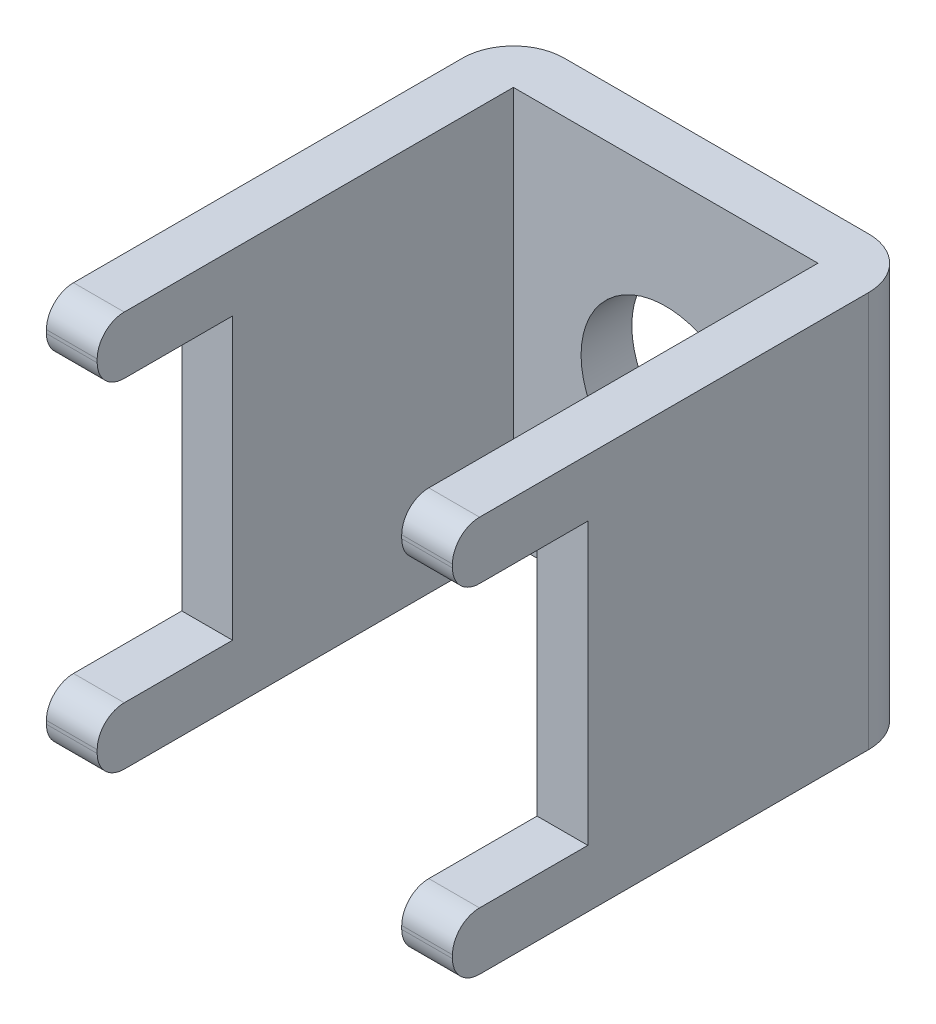
ISO-10303-21;
HEADER;
FILE_DESCRIPTION(('STEP AP214'),'2;1');
FILE_NAME('part.step','',(''),(''),'','','');
FILE_SCHEMA(('AUTOMOTIVE_DESIGN { 1 0 10303 214 1 1 1 1 }'));
ENDSEC;
DATA;
#1=APPLICATION_CONTEXT('core data for automotive mechanical design processes');
#2=APPLICATION_PROTOCOL_DEFINITION('international standard','automotive_design',2000,#1);
#3=PRODUCT_CONTEXT('',#1,'mechanical');
#4=PRODUCT('Part','Part','',(#3));
#5=PRODUCT_RELATED_PRODUCT_CATEGORY('part','',(#4));
#6=PRODUCT_DEFINITION_FORMATION('','',#4);
#7=PRODUCT_DEFINITION_CONTEXT('part definition',#1,'design');
#8=PRODUCT_DEFINITION('design','',#6,#7);
#9=PRODUCT_DEFINITION_SHAPE('','',#8);
#10=(LENGTH_UNIT() NAMED_UNIT(*) SI_UNIT(.MILLI.,.METRE.));
#11=(NAMED_UNIT(*) PLANE_ANGLE_UNIT() SI_UNIT($,.RADIAN.));
#12=(NAMED_UNIT(*) SI_UNIT($,.STERADIAN.) SOLID_ANGLE_UNIT());
#13=UNCERTAINTY_MEASURE_WITH_UNIT(LENGTH_MEASURE(1.E-05),#10,'distance_accuracy_value','');
#14=(GEOMETRIC_REPRESENTATION_CONTEXT(3) GLOBAL_UNCERTAINTY_ASSIGNED_CONTEXT((#13)) GLOBAL_UNIT_ASSIGNED_CONTEXT((#10,
#11,#12)) REPRESENTATION_CONTEXT('',''));
#15=CARTESIAN_POINT('',(0.,0.,0.));
#16=DIRECTION('',(0.,0.,1.));
#17=DIRECTION('',(1.,0.,0.));
#18=AXIS2_PLACEMENT_3D('',#15,#16,#17);
#19=CARTESIAN_POINT('',(10.5,11.7,0.));
#20=DIRECTION('',(0.,0.,-1.));
#21=DIRECTION('',(-1.,0.,0.));
#22=AXIS2_PLACEMENT_3D('',#19,#20,#21);
#23=PLANE('',#22);
#24=DIRECTION('',(0.,-1.,0.));
#25=VECTOR('',#24,1.);
#26=CARTESIAN_POINT('',(9.,11.7,0.));
#27=LINE('',#26,#25);
#28=CARTESIAN_POINT('',(9.,10.9,0.));
#29=VERTEX_POINT('',#28);
#30=CARTESIAN_POINT('',(9.,10.8,0.));
#31=VERTEX_POINT('',#30);
#32=EDGE_CURVE('E329',#29,#31,#27,.T.);
#33=ORIENTED_EDGE('',*,*,#32,.T.);
#34=DIRECTION('',(1.,0.,0.));
#35=VECTOR('',#34,1.);
#36=CARTESIAN_POINT('',(10.5,10.8,0.));
#37=LINE('',#36,#35);
#38=CARTESIAN_POINT('',(10.5,10.8,0.));
#39=VERTEX_POINT('',#38);
#40=EDGE_CURVE('E338',#31,#39,#37,.T.);
#41=ORIENTED_EDGE('',*,*,#40,.T.);
#42=DIRECTION('',(0.,-1.,0.));
#43=VECTOR('',#42,1.);
#44=CARTESIAN_POINT('',(10.5,11.7,0.));
#45=LINE('',#44,#43);
#46=CARTESIAN_POINT('',(10.5,10.9,0.));
#47=VERTEX_POINT('',#46);
#48=EDGE_CURVE('E325',#47,#39,#45,.T.);
#49=ORIENTED_EDGE('',*,*,#48,.F.);
#50=DIRECTION('',(1.,0.,0.));
#51=VECTOR('',#50,1.);
#52=CARTESIAN_POINT('',(10.5,10.9,0.));
#53=LINE('',#52,#51);
#54=EDGE_CURVE('E336',#47,#29,#53,.F.);
#55=ORIENTED_EDGE('',*,*,#54,.T.);
#56=EDGE_LOOP('',(#33,#41,#49,#55));
#57=FACE_BOUND('',#56,.T.);
#58=ADVANCED_FACE('F39',(#57),#23,.F.);
#59=CARTESIAN_POINT('',(0.,11.7,0.));
#60=DIRECTION('',(0.,0.,-1.));
#61=DIRECTION('',(-1.,0.,0.));
#62=AXIS2_PLACEMENT_3D('',#59,#60,#61);
#63=PLANE('',#62);
#64=DIRECTION('',(0.,-1.,0.));
#65=VECTOR('',#64,1.);
#66=CARTESIAN_POINT('',(-1.5,11.7,0.));
#67=LINE('',#66,#65);
#68=CARTESIAN_POINT('',(-1.5,10.9,0.));
#69=VERTEX_POINT('',#68);
#70=CARTESIAN_POINT('',(-1.5,10.8,0.));
#71=VERTEX_POINT('',#70);
#72=EDGE_CURVE('E309',#69,#71,#67,.T.);
#73=ORIENTED_EDGE('',*,*,#72,.T.);
#74=DIRECTION('',(1.,0.,0.));
#75=VECTOR('',#74,1.);
#76=CARTESIAN_POINT('',(0.,10.8,0.));
#77=LINE('',#76,#75);
#78=CARTESIAN_POINT('',(0.,10.8,0.));
#79=VERTEX_POINT('',#78);
#80=EDGE_CURVE('E377',#71,#79,#77,.T.);
#81=ORIENTED_EDGE('',*,*,#80,.T.);
#82=DIRECTION('',(0.,-1.,0.));
#83=VECTOR('',#82,1.);
#84=CARTESIAN_POINT('',(0.,11.7,0.));
#85=LINE('',#84,#83);
#86=CARTESIAN_POINT('',(0.,10.9,0.));
#87=VERTEX_POINT('',#86);
#88=EDGE_CURVE('E306',#87,#79,#85,.T.);
#89=ORIENTED_EDGE('',*,*,#88,.F.);
#90=DIRECTION('',(1.,0.,0.));
#91=VECTOR('',#90,1.);
#92=CARTESIAN_POINT('',(0.,10.9,0.));
#93=LINE('',#92,#91);
#94=EDGE_CURVE('E375',#87,#69,#93,.F.);
#95=ORIENTED_EDGE('',*,*,#94,.T.);
#96=EDGE_LOOP('',(#73,#81,#89,#95));
#97=FACE_BOUND('',#96,.T.);
#98=ADVANCED_FACE('F461',(#97),#63,.F.);
#99=CARTESIAN_POINT('',(0.,11.7,-12.3));
#100=DIRECTION('',(-1.,0.,0.));
#101=DIRECTION('',(0.,0.,1.));
#102=AXIS2_PLACEMENT_3D('',#99,#100,#101);
#103=PLANE('',#102);
#104=ORIENTED_EDGE('',*,*,#88,.T.);
#105=CARTESIAN_POINT('',(0.,10.8,-0.8));
#106=DIRECTION('',(-1.,0.,0.));
#107=DIRECTION('',(0.,0.,1.));
#108=AXIS2_PLACEMENT_3D('',#105,#106,#107);
#109=CIRCLE('',#108,0.8);
#110=CARTESIAN_POINT('',(0.,10.,-0.8));
#111=VERTEX_POINT('',#110);
#112=EDGE_CURVE('E386',#79,#111,#109,.F.);
#113=ORIENTED_EDGE('',*,*,#112,.T.);
#114=DIRECTION('',(0.,0.,-1.));
#115=VECTOR('',#114,1.);
#116=CARTESIAN_POINT('',(0.,10.,-12.3));
#117=LINE('',#116,#115);
#118=CARTESIAN_POINT('',(0.,10.,-4.));
#119=VERTEX_POINT('',#118);
#120=EDGE_CURVE('E262',#111,#119,#117,.T.);
#121=ORIENTED_EDGE('',*,*,#120,.T.);
#122=DIRECTION('',(0.,-1.,0.));
#123=VECTOR('',#122,1.);
#124=CARTESIAN_POINT('',(0.,11.7,-4.));
#125=LINE('',#124,#123);
#126=CARTESIAN_POINT('',(0.,1.7,-4.));
#127=VERTEX_POINT('',#126);
#128=EDGE_CURVE('E265',#119,#127,#125,.T.);
#129=ORIENTED_EDGE('',*,*,#128,.T.);
#130=DIRECTION('',(0.,0.,1.));
#131=VECTOR('',#130,1.);
#132=CARTESIAN_POINT('',(0.,1.7,-12.3));
#133=LINE('',#132,#131);
#134=CARTESIAN_POINT('',(0.,1.7,-0.8));
#135=VERTEX_POINT('',#134);
#136=EDGE_CURVE('E256',#127,#135,#133,.T.);
#137=ORIENTED_EDGE('',*,*,#136,.T.);
#138=CARTESIAN_POINT('',(0.,0.9,-0.8));
#139=DIRECTION('',(-1.,0.,0.));
#140=DIRECTION('',(0.,0.,1.));
#141=AXIS2_PLACEMENT_3D('',#138,#139,#140);
#142=CIRCLE('',#141,0.8);
#143=CARTESIAN_POINT('',(0.,0.9,0.));
#144=VERTEX_POINT('',#143);
#145=EDGE_CURVE('E380',#135,#144,#142,.F.);
#146=ORIENTED_EDGE('',*,*,#145,.T.);
#147=CARTESIAN_POINT('',(0.,0.8,0.));
#148=VERTEX_POINT('',#147);
#149=EDGE_CURVE('E288',#144,#148,#85,.T.);
#150=ORIENTED_EDGE('',*,*,#149,.T.);
#151=CARTESIAN_POINT('',(0.,0.8,-0.8));
#152=DIRECTION('',(-1.,0.,0.));
#153=DIRECTION('',(0.,0.,1.));
#154=AXIS2_PLACEMENT_3D('',#151,#152,#153);
#155=CIRCLE('',#154,0.8);
#156=CARTESIAN_POINT('',(0.,0.,-0.800000000000004));
#157=VERTEX_POINT('',#156);
#158=EDGE_CURVE('E382',#148,#157,#155,.F.);
#159=ORIENTED_EDGE('',*,*,#158,.T.);
#160=DIRECTION('',(0.,0.,-1.));
#161=VECTOR('',#160,1.);
#162=CARTESIAN_POINT('',(0.,0.,-12.3));
#163=LINE('',#162,#161);
#164=CARTESIAN_POINT('',(0.,0.,-12.3));
#165=VERTEX_POINT('',#164);
#166=EDGE_CURVE('E268',#157,#165,#163,.T.);
#167=ORIENTED_EDGE('',*,*,#166,.T.);
#168=DIRECTION('',(0.,-1.,0.));
#169=VECTOR('',#168,1.);
#170=CARTESIAN_POINT('',(0.,11.7,-12.3));
#171=LINE('',#170,#169);
#172=CARTESIAN_POINT('',(0.,11.7,-12.3));
#173=VERTEX_POINT('',#172);
#174=EDGE_CURVE('E333',#173,#165,#171,.T.);
#175=ORIENTED_EDGE('',*,*,#174,.F.);
#176=DIRECTION('',(0.,0.,-1.));
#177=VECTOR('',#176,1.);
#178=CARTESIAN_POINT('',(0.,11.7,-12.3));
#179=LINE('',#178,#177);
#180=CARTESIAN_POINT('',(0.,11.7,-0.800000000000004));
#181=VERTEX_POINT('',#180);
#182=EDGE_CURVE('E269',#181,#173,#179,.T.);
#183=ORIENTED_EDGE('',*,*,#182,.F.);
#184=CARTESIAN_POINT('',(0.,10.9,-0.8));
#185=DIRECTION('',(-1.,0.,0.));
#186=DIRECTION('',(0.,0.,1.));
#187=AXIS2_PLACEMENT_3D('',#184,#185,#186);
#188=CIRCLE('',#187,0.8);
#189=EDGE_CURVE('E384',#181,#87,#188,.F.);
#190=ORIENTED_EDGE('',*,*,#189,.T.);
#191=EDGE_LOOP('',(#104,#113,#121,#129,#137,#146,#150,#159,#167,#175,#183,#190));
#192=FACE_BOUND('',#191,.T.);
#193=ADVANCED_FACE('F406',(#192),#103,.F.);
#194=CARTESIAN_POINT('',(9.,11.7,-12.3));
#195=DIRECTION('',(0.,0.,-1.));
#196=DIRECTION('',(-1.,0.,0.));
#197=AXIS2_PLACEMENT_3D('',#194,#195,#196);
#198=PLANE('',#197);
#199=CARTESIAN_POINT('',(4.5,5.85,-12.3));
#200=DIRECTION('',(0.,0.,-1.));
#201=DIRECTION('',(-1.,0.,0.));
#202=AXIS2_PLACEMENT_3D('',#199,#200,#201);
#203=CIRCLE('',#202,2.5);
#204=CARTESIAN_POINT('',(2.,5.85,-12.3));
#205=VERTEX_POINT('',#204);
#206=EDGE_CURVE('E225',#205,#205,#203,.F.);
#207=ORIENTED_EDGE('',*,*,#206,.F.);
#208=EDGE_LOOP('',(#207));
#209=FACE_BOUND('',#208,.T.);
#210=DIRECTION('',(1.,0.,0.));
#211=VECTOR('',#210,1.);
#212=CARTESIAN_POINT('',(9.,0.,-12.3));
#213=LINE('',#212,#211);
#214=CARTESIAN_POINT('',(9.,0.,-12.3));
#215=VERTEX_POINT('',#214);
#216=EDGE_CURVE('E290',#165,#215,#213,.T.);
#217=ORIENTED_EDGE('',*,*,#216,.T.);
#218=DIRECTION('',(0.,-1.,0.));
#219=VECTOR('',#218,1.);
#220=CARTESIAN_POINT('',(9.,11.7,-12.3));
#221=LINE('',#220,#219);
#222=CARTESIAN_POINT('',(9.,11.7,-12.3));
#223=VERTEX_POINT('',#222);
#224=EDGE_CURVE('E330',#223,#215,#221,.T.);
#225=ORIENTED_EDGE('',*,*,#224,.F.);
#226=DIRECTION('',(1.,0.,0.));
#227=VECTOR('',#226,1.);
#228=CARTESIAN_POINT('',(9.,11.7,-12.3));
#229=LINE('',#228,#227);
#230=EDGE_CURVE('E271',#173,#223,#229,.T.);
#231=ORIENTED_EDGE('',*,*,#230,.F.);
#232=ORIENTED_EDGE('',*,*,#174,.T.);
#233=EDGE_LOOP('',(#217,#225,#231,#232));
#234=FACE_BOUND('',#233,.T.);
#235=ADVANCED_FACE('F481',(#209,#234),#198,.F.);
#236=CARTESIAN_POINT('',(9.,11.7,0.));
#237=DIRECTION('',(1.,0.,0.));
#238=DIRECTION('',(0.,0.,-1.));
#239=AXIS2_PLACEMENT_3D('',#236,#237,#238);
#240=PLANE('',#239);
#241=DIRECTION('',(0.,0.,1.));
#242=VECTOR('',#241,1.);
#243=CARTESIAN_POINT('',(9.,10.,0.));
#244=LINE('',#243,#242);
#245=CARTESIAN_POINT('',(9.00000000000001,10.,-4.));
#246=VERTEX_POINT('',#245);
#247=CARTESIAN_POINT('',(9.,10.,-0.8));
#248=VERTEX_POINT('',#247);
#249=EDGE_CURVE('E259',#246,#248,#244,.T.);
#250=ORIENTED_EDGE('',*,*,#249,.T.);
#251=CARTESIAN_POINT('',(9.,10.8,-0.8));
#252=DIRECTION('',(1.,0.,0.));
#253=DIRECTION('',(0.,0.,-1.));
#254=AXIS2_PLACEMENT_3D('',#251,#252,#253);
#255=CIRCLE('',#254,0.8);
#256=EDGE_CURVE('E357',#248,#31,#255,.F.);
#257=ORIENTED_EDGE('',*,*,#256,.T.);
#258=ORIENTED_EDGE('',*,*,#32,.F.);
#259=CARTESIAN_POINT('',(9.,10.9,-0.8));
#260=DIRECTION('',(1.,0.,0.));
#261=DIRECTION('',(0.,0.,-1.));
#262=AXIS2_PLACEMENT_3D('',#259,#260,#261);
#263=CIRCLE('',#262,0.8);
#264=CARTESIAN_POINT('',(9.,11.7,-0.8));
#265=VERTEX_POINT('',#264);
#266=EDGE_CURVE('E355',#29,#265,#263,.F.);
#267=ORIENTED_EDGE('',*,*,#266,.T.);
#268=DIRECTION('',(0.,0.,1.));
#269=VECTOR('',#268,1.);
#270=CARTESIAN_POINT('',(9.,11.7,0.));
#271=LINE('',#270,#269);
#272=EDGE_CURVE('E274',#223,#265,#271,.T.);
#273=ORIENTED_EDGE('',*,*,#272,.F.);
#274=ORIENTED_EDGE('',*,*,#224,.T.);
#275=DIRECTION('',(0.,0.,1.));
#276=VECTOR('',#275,1.);
#277=CARTESIAN_POINT('',(9.,0.,0.));
#278=LINE('',#277,#276);
#279=CARTESIAN_POINT('',(9.,0.,-0.8));
#280=VERTEX_POINT('',#279);
#281=EDGE_CURVE('E292',#215,#280,#278,.T.);
#282=ORIENTED_EDGE('',*,*,#281,.T.);
#283=CARTESIAN_POINT('',(9.,0.8,-0.8));
#284=DIRECTION('',(1.,0.,0.));
#285=DIRECTION('',(0.,0.,-1.));
#286=AXIS2_PLACEMENT_3D('',#283,#284,#285);
#287=CIRCLE('',#286,0.8);
#288=CARTESIAN_POINT('',(9.,0.8,0.));
#289=VERTEX_POINT('',#288);
#290=EDGE_CURVE('E353',#280,#289,#287,.F.);
#291=ORIENTED_EDGE('',*,*,#290,.T.);
#292=CARTESIAN_POINT('',(9.,0.9,0.));
#293=VERTEX_POINT('',#292);
#294=EDGE_CURVE('E326',#293,#289,#27,.T.);
#295=ORIENTED_EDGE('',*,*,#294,.F.);
#296=CARTESIAN_POINT('',(9.00000000000001,0.9,-0.8));
#297=DIRECTION('',(1.,0.,0.));
#298=DIRECTION('',(0.,0.,-1.));
#299=AXIS2_PLACEMENT_3D('',#296,#297,#298);
#300=CIRCLE('',#299,0.8);
#301=CARTESIAN_POINT('',(9.,1.7,-0.8));
#302=VERTEX_POINT('',#301);
#303=EDGE_CURVE('E351',#293,#302,#300,.F.);
#304=ORIENTED_EDGE('',*,*,#303,.T.);
#305=DIRECTION('',(0.,0.,-1.));
#306=VECTOR('',#305,1.);
#307=CARTESIAN_POINT('',(9.,1.7,0.));
#308=LINE('',#307,#306);
#309=CARTESIAN_POINT('',(9.00000000000001,1.7,-4.));
#310=VERTEX_POINT('',#309);
#311=EDGE_CURVE('E253',#302,#310,#308,.T.);
#312=ORIENTED_EDGE('',*,*,#311,.T.);
#313=DIRECTION('',(0.,1.,0.));
#314=VECTOR('',#313,1.);
#315=CARTESIAN_POINT('',(9.,11.7,-4.));
#316=LINE('',#315,#314);
#317=EDGE_CURVE('E234',#310,#246,#316,.T.);
#318=ORIENTED_EDGE('',*,*,#317,.T.);
#319=EDGE_LOOP('',(#250,#257,#258,#267,#273,#274,#282,#291,#295,#304,#312,#318));
#320=FACE_BOUND('',#319,.T.);
#321=ADVANCED_FACE('F475',(#320),#240,.F.);
#322=ORIENTED_EDGE('',*,*,#294,.T.);
#323=DIRECTION('',(1.,0.,0.));
#324=VECTOR('',#323,1.);
#325=CARTESIAN_POINT('',(10.5,0.8,0.));
#326=LINE('',#325,#324);
#327=CARTESIAN_POINT('',(10.5,0.8,0.));
#328=VERTEX_POINT('',#327);
#329=EDGE_CURVE('E367',#289,#328,#326,.T.);
#330=ORIENTED_EDGE('',*,*,#329,.T.);
#331=CARTESIAN_POINT('',(10.5,0.9,0.));
#332=VERTEX_POINT('',#331);
#333=EDGE_CURVE('E322',#332,#328,#45,.T.);
#334=ORIENTED_EDGE('',*,*,#333,.F.);
#335=DIRECTION('',(1.,0.,0.));
#336=VECTOR('',#335,1.);
#337=CARTESIAN_POINT('',(10.5,0.9,0.));
#338=LINE('',#337,#336);
#339=EDGE_CURVE('E365',#332,#293,#338,.F.);
#340=ORIENTED_EDGE('',*,*,#339,.T.);
#341=EDGE_LOOP('',(#322,#330,#334,#340));
#342=FACE_BOUND('',#341,.T.);
#343=ADVANCED_FACE('F464',(#342),#23,.F.);
#344=CARTESIAN_POINT('',(10.5,11.7,-12.3));
#345=DIRECTION('',(-1.,0.,0.));
#346=DIRECTION('',(0.,0.,1.));
#347=AXIS2_PLACEMENT_3D('',#344,#345,#346);
#348=PLANE('',#347);
#349=ORIENTED_EDGE('',*,*,#48,.T.);
#350=CARTESIAN_POINT('',(10.5,10.8,-0.800000000000001));
#351=DIRECTION('',(-1.,0.,0.));
#352=DIRECTION('',(0.,0.,1.));
#353=AXIS2_PLACEMENT_3D('',#350,#351,#352);
#354=CIRCLE('',#353,0.8);
#355=CARTESIAN_POINT('',(10.5,10.,-0.800000000000001));
#356=VERTEX_POINT('',#355);
#357=EDGE_CURVE('E347',#39,#356,#354,.F.);
#358=ORIENTED_EDGE('',*,*,#357,.T.);
#359=DIRECTION('',(0.,0.,1.));
#360=VECTOR('',#359,1.);
#361=CARTESIAN_POINT('',(10.5,10.,0.));
#362=LINE('',#361,#360);
#363=CARTESIAN_POINT('',(10.5,10.,-4.));
#364=VERTEX_POINT('',#363);
#365=EDGE_CURVE('E236',#364,#356,#362,.T.);
#366=ORIENTED_EDGE('',*,*,#365,.F.);
#367=DIRECTION('',(0.,1.,0.));
#368=VECTOR('',#367,1.);
#369=CARTESIAN_POINT('',(10.5,10.,-4.));
#370=LINE('',#369,#368);
#371=CARTESIAN_POINT('',(10.5,1.7,-4.));
#372=VERTEX_POINT('',#371);
#373=EDGE_CURVE('E224',#372,#364,#370,.T.);
#374=ORIENTED_EDGE('',*,*,#373,.F.);
#375=DIRECTION('',(0.,0.,-1.));
#376=VECTOR('',#375,1.);
#377=CARTESIAN_POINT('',(10.5,1.7,0.));
#378=LINE('',#377,#376);
#379=CARTESIAN_POINT('',(10.5,1.7,-0.800000000000001));
#380=VERTEX_POINT('',#379);
#381=EDGE_CURVE('E215',#380,#372,#378,.T.);
#382=ORIENTED_EDGE('',*,*,#381,.F.);
#383=CARTESIAN_POINT('',(10.5,0.9,-0.800000000000001));
#384=DIRECTION('',(-1.,0.,0.));
#385=DIRECTION('',(0.,0.,1.));
#386=AXIS2_PLACEMENT_3D('',#383,#384,#385);
#387=CIRCLE('',#386,0.8);
#388=EDGE_CURVE('E341',#380,#332,#387,.F.);
#389=ORIENTED_EDGE('',*,*,#388,.T.);
#390=ORIENTED_EDGE('',*,*,#333,.T.);
#391=CARTESIAN_POINT('',(10.5,0.8,-0.800000000000001));
#392=DIRECTION('',(-1.,0.,0.));
#393=DIRECTION('',(0.,0.,1.));
#394=AXIS2_PLACEMENT_3D('',#391,#392,#393);
#395=CIRCLE('',#394,0.8);
#396=CARTESIAN_POINT('',(10.5,0.,-0.800000000000004));
#397=VERTEX_POINT('',#396);
#398=EDGE_CURVE('E343',#328,#397,#395,.F.);
#399=ORIENTED_EDGE('',*,*,#398,.T.);
#400=DIRECTION('',(0.,0.,-1.));
#401=VECTOR('',#400,1.);
#402=CARTESIAN_POINT('',(10.5,0.,-12.3));
#403=LINE('',#402,#401);
#404=CARTESIAN_POINT('',(10.5,0.,-12.3));
#405=VERTEX_POINT('',#404);
#406=EDGE_CURVE('E295',#397,#405,#403,.T.);
#407=ORIENTED_EDGE('',*,*,#406,.T.);
#408=DIRECTION('',(0.,-1.,0.));
#409=VECTOR('',#408,1.);
#410=CARTESIAN_POINT('',(10.5,11.7,-12.3));
#411=LINE('',#410,#409);
#412=CARTESIAN_POINT('',(10.5,11.7,-12.3));
#413=VERTEX_POINT('',#412);
#414=EDGE_CURVE('E319',#413,#405,#411,.T.);
#415=ORIENTED_EDGE('',*,*,#414,.F.);
#416=DIRECTION('',(0.,0.,-1.));
#417=VECTOR('',#416,1.);
#418=CARTESIAN_POINT('',(10.5,11.7,-12.3));
#419=LINE('',#418,#417);
#420=CARTESIAN_POINT('',(10.5,11.7,-0.800000000000004));
#421=VERTEX_POINT('',#420);
#422=EDGE_CURVE('E277',#421,#413,#419,.T.);
#423=ORIENTED_EDGE('',*,*,#422,.F.);
#424=CARTESIAN_POINT('',(10.5,10.9,-0.8));
#425=DIRECTION('',(-1.,0.,0.));
#426=DIRECTION('',(0.,0.,1.));
#427=AXIS2_PLACEMENT_3D('',#424,#425,#426);
#428=CIRCLE('',#427,0.8);
#429=EDGE_CURVE('E345',#421,#47,#428,.F.);
#430=ORIENTED_EDGE('',*,*,#429,.T.);
#431=EDGE_LOOP('',(#349,#358,#366,#374,#382,#389,#390,#399,#407,#415,#423,#430));
#432=FACE_BOUND('',#431,.T.);
#433=ADVANCED_FACE('F239',(#432),#348,.F.);
#434=CARTESIAN_POINT('',(9.,11.7,-12.3));
#435=DIRECTION('',(0.,-1.,0.));
#436=DIRECTION('',(0.,0.,-1.));
#437=AXIS2_PLACEMENT_3D('',#434,#435,#436);
#438=CYLINDRICAL_SURFACE('',#437,1.5);
#439=CARTESIAN_POINT('',(9.,0.,-12.3));
#440=DIRECTION('',(0.,1.,0.));
#441=DIRECTION('',(0.,0.,-1.));
#442=AXIS2_PLACEMENT_3D('',#439,#440,#441);
#443=CIRCLE('',#442,1.5);
#444=CARTESIAN_POINT('',(9.,0.,-13.8));
#445=VERTEX_POINT('',#444);
#446=EDGE_CURVE('E297',#405,#445,#443,.T.);
#447=ORIENTED_EDGE('',*,*,#446,.T.);
#448=DIRECTION('',(0.,-1.,0.));
#449=VECTOR('',#448,1.);
#450=CARTESIAN_POINT('',(9.,11.7,-13.8));
#451=LINE('',#450,#449);
#452=CARTESIAN_POINT('',(9.,11.7,-13.8));
#453=VERTEX_POINT('',#452);
#454=EDGE_CURVE('E316',#453,#445,#451,.T.);
#455=ORIENTED_EDGE('',*,*,#454,.F.);
#456=CARTESIAN_POINT('',(9.,11.7,-12.3));
#457=DIRECTION('',(0.,1.,0.));
#458=DIRECTION('',(0.,0.,-1.));
#459=AXIS2_PLACEMENT_3D('',#456,#457,#458);
#460=CIRCLE('',#459,1.5);
#461=EDGE_CURVE('E279',#413,#453,#460,.T.);
#462=ORIENTED_EDGE('',*,*,#461,.F.);
#463=ORIENTED_EDGE('',*,*,#414,.T.);
#464=EDGE_LOOP('',(#447,#455,#462,#463));
#465=FACE_BOUND('',#464,.T.);
#466=ADVANCED_FACE('F433',(#465),#438,.T.);
#467=CARTESIAN_POINT('',(0.,11.7,-13.8));
#468=DIRECTION('',(0.,0.,1.));
#469=DIRECTION('',(1.,0.,0.));
#470=AXIS2_PLACEMENT_3D('',#467,#468,#469);
#471=PLANE('',#470);
#472=CARTESIAN_POINT('',(4.5,5.85,-13.8));
#473=DIRECTION('',(0.,0.,-1.));
#474=DIRECTION('',(-1.,0.,0.));
#475=AXIS2_PLACEMENT_3D('',#472,#473,#474);
#476=CIRCLE('',#475,2.5);
#477=CARTESIAN_POINT('',(2.,5.85,-13.8));
#478=VERTEX_POINT('',#477);
#479=EDGE_CURVE('E423',#478,#478,#476,.T.);
#480=ORIENTED_EDGE('',*,*,#479,.F.);
#481=EDGE_LOOP('',(#480));
#482=FACE_BOUND('',#481,.T.);
#483=DIRECTION('',(-1.,0.,0.));
#484=VECTOR('',#483,1.);
#485=CARTESIAN_POINT('',(0.,0.,-13.8));
#486=LINE('',#485,#484);
#487=CARTESIAN_POINT('',(0.,0.,-13.8));
#488=VERTEX_POINT('',#487);
#489=EDGE_CURVE('E299',#445,#488,#486,.T.);
#490=ORIENTED_EDGE('',*,*,#489,.T.);
#491=DIRECTION('',(0.,-1.,0.));
#492=VECTOR('',#491,1.);
#493=CARTESIAN_POINT('',(0.,11.7,-13.8));
#494=LINE('',#493,#492);
#495=CARTESIAN_POINT('',(0.,11.7,-13.8));
#496=VERTEX_POINT('',#495);
#497=EDGE_CURVE('E313',#496,#488,#494,.T.);
#498=ORIENTED_EDGE('',*,*,#497,.F.);
#499=DIRECTION('',(-1.,0.,0.));
#500=VECTOR('',#499,1.);
#501=CARTESIAN_POINT('',(0.,11.7,-13.8));
#502=LINE('',#501,#500);
#503=EDGE_CURVE('E281',#453,#496,#502,.T.);
#504=ORIENTED_EDGE('',*,*,#503,.F.);
#505=ORIENTED_EDGE('',*,*,#454,.T.);
#506=EDGE_LOOP('',(#490,#498,#504,#505));
#507=FACE_BOUND('',#506,.T.);
#508=ADVANCED_FACE('F429',(#482,#507),#471,.F.);
#509=CARTESIAN_POINT('',(0.,11.7,-12.3));
#510=DIRECTION('',(0.,-1.,0.));
#511=DIRECTION('',(0.,0.,-1.));
#512=AXIS2_PLACEMENT_3D('',#509,#510,#511);
#513=CYLINDRICAL_SURFACE('',#512,1.5);
#514=CARTESIAN_POINT('',(0.,0.,-12.3));
#515=DIRECTION('',(0.,1.,0.));
#516=DIRECTION('',(0.,0.,-1.));
#517=AXIS2_PLACEMENT_3D('',#514,#515,#516);
#518=CIRCLE('',#517,1.5);
#519=CARTESIAN_POINT('',(-1.5,0.,-12.3));
#520=VERTEX_POINT('',#519);
#521=EDGE_CURVE('E301',#488,#520,#518,.T.);
#522=ORIENTED_EDGE('',*,*,#521,.T.);
#523=DIRECTION('',(0.,-1.,0.));
#524=VECTOR('',#523,1.);
#525=CARTESIAN_POINT('',(-1.5,11.7,-12.3));
#526=LINE('',#525,#524);
#527=CARTESIAN_POINT('',(-1.5,11.7,-12.3));
#528=VERTEX_POINT('',#527);
#529=EDGE_CURVE('E310',#528,#520,#526,.T.);
#530=ORIENTED_EDGE('',*,*,#529,.F.);
#531=CARTESIAN_POINT('',(0.,11.7,-12.3));
#532=DIRECTION('',(0.,1.,0.));
#533=DIRECTION('',(0.,0.,-1.));
#534=AXIS2_PLACEMENT_3D('',#531,#532,#533);
#535=CIRCLE('',#534,1.5);
#536=EDGE_CURVE('E283',#496,#528,#535,.T.);
#537=ORIENTED_EDGE('',*,*,#536,.F.);
#538=ORIENTED_EDGE('',*,*,#497,.T.);
#539=EDGE_LOOP('',(#522,#530,#537,#538));
#540=FACE_BOUND('',#539,.T.);
#541=ADVANCED_FACE('F432',(#540),#513,.T.);
#542=CARTESIAN_POINT('',(-1.5,11.7,0.));
#543=DIRECTION('',(1.,0.,0.));
#544=DIRECTION('',(0.,0.,-1.));
#545=AXIS2_PLACEMENT_3D('',#542,#543,#544);
#546=PLANE('',#545);
#547=DIRECTION('',(0.,0.,-1.));
#548=VECTOR('',#547,1.);
#549=CARTESIAN_POINT('',(-1.5,10.,0.));
#550=LINE('',#549,#548);
#551=CARTESIAN_POINT('',(-1.5,10.,-0.8));
#552=VERTEX_POINT('',#551);
#553=CARTESIAN_POINT('',(-1.5,10.,-4.));
#554=VERTEX_POINT('',#553);
#555=EDGE_CURVE('E254',#552,#554,#550,.T.);
#556=ORIENTED_EDGE('',*,*,#555,.F.);
#557=CARTESIAN_POINT('',(-1.5,10.8,-0.8));
#558=DIRECTION('',(1.,0.,0.));
#559=DIRECTION('',(0.,0.,-1.));
#560=AXIS2_PLACEMENT_3D('',#557,#558,#559);
#561=CIRCLE('',#560,0.8);
#562=EDGE_CURVE('E394',#552,#71,#561,.F.);
#563=ORIENTED_EDGE('',*,*,#562,.T.);
#564=ORIENTED_EDGE('',*,*,#72,.F.);
#565=CARTESIAN_POINT('',(-1.5,10.9,-0.8));
#566=DIRECTION('',(1.,0.,0.));
#567=DIRECTION('',(0.,0.,-1.));
#568=AXIS2_PLACEMENT_3D('',#565,#566,#567);
#569=CIRCLE('',#568,0.8);
#570=CARTESIAN_POINT('',(-1.5,11.7,-0.8));
#571=VERTEX_POINT('',#570);
#572=EDGE_CURVE('E392',#69,#571,#569,.F.);
#573=ORIENTED_EDGE('',*,*,#572,.T.);
#574=DIRECTION('',(0.,0.,1.));
#575=VECTOR('',#574,1.);
#576=CARTESIAN_POINT('',(-1.5,11.7,0.));
#577=LINE('',#576,#575);
#578=EDGE_CURVE('E285',#528,#571,#577,.T.);
#579=ORIENTED_EDGE('',*,*,#578,.F.);
#580=ORIENTED_EDGE('',*,*,#529,.T.);
#581=DIRECTION('',(0.,0.,1.));
#582=VECTOR('',#581,1.);
#583=CARTESIAN_POINT('',(-1.5,0.,0.));
#584=LINE('',#583,#582);
#585=CARTESIAN_POINT('',(-1.5,0.,-0.8));
#586=VERTEX_POINT('',#585);
#587=EDGE_CURVE('E272',#520,#586,#584,.T.);
#588=ORIENTED_EDGE('',*,*,#587,.T.);
#589=CARTESIAN_POINT('',(-1.5,0.8,-0.8));
#590=DIRECTION('',(1.,0.,0.));
#591=DIRECTION('',(0.,0.,-1.));
#592=AXIS2_PLACEMENT_3D('',#589,#590,#591);
#593=CIRCLE('',#592,0.8);
#594=CARTESIAN_POINT('',(-1.5,0.8,0.));
#595=VERTEX_POINT('',#594);
#596=EDGE_CURVE('E60',#586,#595,#593,.F.);
#597=ORIENTED_EDGE('',*,*,#596,.T.);
#598=CARTESIAN_POINT('',(-1.5,0.9,0.));
#599=VERTEX_POINT('',#598);
#600=EDGE_CURVE('E307',#599,#595,#67,.T.);
#601=ORIENTED_EDGE('',*,*,#600,.F.);
#602=CARTESIAN_POINT('',(-1.5,0.9,-0.8));
#603=DIRECTION('',(1.,0.,0.));
#604=DIRECTION('',(0.,0.,-1.));
#605=AXIS2_PLACEMENT_3D('',#602,#603,#604);
#606=CIRCLE('',#605,0.8);
#607=CARTESIAN_POINT('',(-1.5,1.7,-0.8));
#608=VERTEX_POINT('',#607);
#609=EDGE_CURVE('E54',#599,#608,#606,.F.);
#610=ORIENTED_EDGE('',*,*,#609,.T.);
#611=DIRECTION('',(0.,0.,1.));
#612=VECTOR('',#611,1.);
#613=CARTESIAN_POINT('',(-1.5,1.7,0.));
#614=LINE('',#613,#612);
#615=CARTESIAN_POINT('',(-1.5,1.7,-4.));
#616=VERTEX_POINT('',#615);
#617=EDGE_CURVE('E251',#616,#608,#614,.T.);
#618=ORIENTED_EDGE('',*,*,#617,.F.);
#619=DIRECTION('',(0.,-1.,0.));
#620=VECTOR('',#619,1.);
#621=CARTESIAN_POINT('',(-1.5,10.,-4.));
#622=LINE('',#621,#620);
#623=EDGE_CURVE('E247',#554,#616,#622,.T.);
#624=ORIENTED_EDGE('',*,*,#623,.F.);
#625=EDGE_LOOP('',(#556,#563,#564,#573,#579,#580,#588,#597,#601,#610,#618,#624));
#626=FACE_BOUND('',#625,.T.);
#627=ADVANCED_FACE('F415',(#626),#546,.F.);
#628=ORIENTED_EDGE('',*,*,#600,.T.);
#629=DIRECTION('',(1.,0.,0.));
#630=VECTOR('',#629,1.);
#631=CARTESIAN_POINT('',(0.,0.8,0.));
#632=LINE('',#631,#630);
#633=EDGE_CURVE('E47',#595,#148,#632,.T.);
#634=ORIENTED_EDGE('',*,*,#633,.T.);
#635=ORIENTED_EDGE('',*,*,#149,.F.);
#636=DIRECTION('',(1.,0.,0.));
#637=VECTOR('',#636,1.);
#638=CARTESIAN_POINT('',(0.,0.9,0.));
#639=LINE('',#638,#637);
#640=EDGE_CURVE('E396',#144,#599,#639,.F.);
#641=ORIENTED_EDGE('',*,*,#640,.T.);
#642=EDGE_LOOP('',(#628,#634,#635,#641));
#643=FACE_BOUND('',#642,.T.);
#644=ADVANCED_FACE('F401',(#643),#63,.F.);
#645=CARTESIAN_POINT('',(0.,11.7,-12.3));
#646=DIRECTION('',(0.,-1.,0.));
#647=DIRECTION('',(0.,0.,-1.));
#648=AXIS2_PLACEMENT_3D('',#645,#646,#647);
#649=PLANE('',#648);
#650=ORIENTED_EDGE('',*,*,#272,.T.);
#651=DIRECTION('',(1.,0.,0.));
#652=VECTOR('',#651,1.);
#653=CARTESIAN_POINT('',(0.,11.7,-0.799999999999999));
#654=LINE('',#653,#652);
#655=EDGE_CURVE('E362',#265,#421,#654,.T.);
#656=ORIENTED_EDGE('',*,*,#655,.T.);
#657=ORIENTED_EDGE('',*,*,#422,.T.);
#658=ORIENTED_EDGE('',*,*,#461,.T.);
#659=ORIENTED_EDGE('',*,*,#503,.T.);
#660=ORIENTED_EDGE('',*,*,#536,.T.);
#661=ORIENTED_EDGE('',*,*,#578,.T.);
#662=DIRECTION('',(1.,0.,0.));
#663=VECTOR('',#662,1.);
#664=CARTESIAN_POINT('',(0.,11.7,-0.8));
#665=LINE('',#664,#663);
#666=EDGE_CURVE('E359',#571,#181,#665,.T.);
#667=ORIENTED_EDGE('',*,*,#666,.T.);
#668=ORIENTED_EDGE('',*,*,#182,.T.);
#669=ORIENTED_EDGE('',*,*,#230,.T.);
#670=EDGE_LOOP('',(#650,#656,#657,#658,#659,#660,#661,#667,#668,#669));
#671=FACE_BOUND('',#670,.T.);
#672=ADVANCED_FACE('F499',(#671),#649,.F.);
#673=CARTESIAN_POINT('',(0.,0.,-12.3));
#674=DIRECTION('',(0.,-1.,0.));
#675=DIRECTION('',(0.,0.,-1.));
#676=AXIS2_PLACEMENT_3D('',#673,#674,#675);
#677=PLANE('',#676);
#678=ORIENTED_EDGE('',*,*,#406,.F.);
#679=DIRECTION('',(1.,0.,0.));
#680=VECTOR('',#679,1.);
#681=CARTESIAN_POINT('',(9.,0.,-0.8));
#682=LINE('',#681,#680);
#683=EDGE_CURVE('E372',#397,#280,#682,.F.);
#684=ORIENTED_EDGE('',*,*,#683,.T.);
#685=ORIENTED_EDGE('',*,*,#281,.F.);
#686=ORIENTED_EDGE('',*,*,#216,.F.);
#687=ORIENTED_EDGE('',*,*,#166,.F.);
#688=DIRECTION('',(1.,0.,0.));
#689=VECTOR('',#688,1.);
#690=CARTESIAN_POINT('',(-1.5,0.,-0.8));
#691=LINE('',#690,#689);
#692=EDGE_CURVE('E370',#157,#586,#691,.F.);
#693=ORIENTED_EDGE('',*,*,#692,.T.);
#694=ORIENTED_EDGE('',*,*,#587,.F.);
#695=ORIENTED_EDGE('',*,*,#521,.F.);
#696=ORIENTED_EDGE('',*,*,#489,.F.);
#697=ORIENTED_EDGE('',*,*,#446,.F.);
#698=EDGE_LOOP('',(#678,#684,#685,#686,#687,#693,#694,#695,#696,#697));
#699=FACE_BOUND('',#698,.T.);
#700=ADVANCED_FACE('F447',(#699),#677,.T.);
#701=CARTESIAN_POINT('',(-10.71357693841,1.7,0.));
#702=DIRECTION('',(0.,-1.,0.));
#703=DIRECTION('',(0.,0.,-1.));
#704=AXIS2_PLACEMENT_3D('',#701,#702,#703);
#705=PLANE('',#704);
#706=ORIENTED_EDGE('',*,*,#617,.T.);
#707=DIRECTION('',(1.,0.,0.));
#708=VECTOR('',#707,1.);
#709=CARTESIAN_POINT('',(-10.71357693841,1.7,-0.8));
#710=LINE('',#709,#708);
#711=EDGE_CURVE('E11',#608,#135,#710,.T.);
#712=ORIENTED_EDGE('',*,*,#711,.T.);
#713=ORIENTED_EDGE('',*,*,#136,.F.);
#714=DIRECTION('',(1.,0.,0.));
#715=VECTOR('',#714,1.);
#716=CARTESIAN_POINT('',(-10.71357693841,1.7,-4.00000000000001));
#717=LINE('',#716,#715);
#718=EDGE_CURVE('E235',#616,#127,#717,.T.);
#719=ORIENTED_EDGE('',*,*,#718,.F.);
#720=EDGE_LOOP('',(#706,#712,#713,#719));
#721=FACE_BOUND('',#720,.T.);
#722=ADVANCED_FACE('F411',(#721),#705,.F.);
#723=CARTESIAN_POINT('',(-10.71357693841,10.,0.));
#724=DIRECTION('',(0.,1.,0.));
#725=DIRECTION('',(0.,0.,1.));
#726=AXIS2_PLACEMENT_3D('',#723,#724,#725);
#727=PLANE('',#726);
#728=ORIENTED_EDGE('',*,*,#120,.F.);
#729=DIRECTION('',(1.,0.,0.));
#730=VECTOR('',#729,1.);
#731=CARTESIAN_POINT('',(-10.71357693841,10.,-0.8));
#732=LINE('',#731,#730);
#733=EDGE_CURVE('E388',#111,#552,#732,.F.);
#734=ORIENTED_EDGE('',*,*,#733,.T.);
#735=ORIENTED_EDGE('',*,*,#555,.T.);
#736=DIRECTION('',(1.,0.,0.));
#737=VECTOR('',#736,1.);
#738=CARTESIAN_POINT('',(-10.71357693841,10.,-4.));
#739=LINE('',#738,#737);
#740=EDGE_CURVE('E245',#554,#119,#739,.T.);
#741=ORIENTED_EDGE('',*,*,#740,.T.);
#742=EDGE_LOOP('',(#728,#734,#735,#741));
#743=FACE_BOUND('',#742,.T.);
#744=ADVANCED_FACE('F554',(#743),#727,.F.);
#745=CARTESIAN_POINT('',(-10.71357693841,10.,-4.));
#746=DIRECTION('',(0.,0.,-1.));
#747=DIRECTION('',(0.,1.,0.));
#748=AXIS2_PLACEMENT_3D('',#745,#746,#747);
#749=PLANE('',#748);
#750=ORIENTED_EDGE('',*,*,#740,.F.);
#751=ORIENTED_EDGE('',*,*,#623,.T.);
#752=ORIENTED_EDGE('',*,*,#718,.T.);
#753=ORIENTED_EDGE('',*,*,#128,.F.);
#754=EDGE_LOOP('',(#750,#751,#752,#753));
#755=FACE_BOUND('',#754,.T.);
#756=ADVANCED_FACE('F555',(#755),#749,.F.);
#757=EDGE_CURVE('E219',#310,#372,#717,.T.);
#758=ORIENTED_EDGE('',*,*,#757,.T.);
#759=ORIENTED_EDGE('',*,*,#373,.T.);
#760=EDGE_CURVE('E248',#246,#364,#739,.T.);
#761=ORIENTED_EDGE('',*,*,#760,.F.);
#762=ORIENTED_EDGE('',*,*,#317,.F.);
#763=EDGE_LOOP('',(#758,#759,#761,#762));
#764=FACE_BOUND('',#763,.T.);
#765=ADVANCED_FACE('F230',(#764),#749,.F.);
#766=ORIENTED_EDGE('',*,*,#365,.T.);
#767=DIRECTION('',(1.,0.,0.));
#768=VECTOR('',#767,1.);
#769=CARTESIAN_POINT('',(-10.71357693841,10.,-0.799999999999998));
#770=LINE('',#769,#768);
#771=EDGE_CURVE('E349',#356,#248,#770,.F.);
#772=ORIENTED_EDGE('',*,*,#771,.T.);
#773=ORIENTED_EDGE('',*,*,#249,.F.);
#774=ORIENTED_EDGE('',*,*,#760,.T.);
#775=EDGE_LOOP('',(#766,#772,#773,#774));
#776=FACE_BOUND('',#775,.T.);
#777=ADVANCED_FACE('F513',(#776),#727,.F.);
#778=ORIENTED_EDGE('',*,*,#311,.F.);
#779=DIRECTION('',(1.,0.,0.));
#780=VECTOR('',#779,1.);
#781=CARTESIAN_POINT('',(-10.71357693841,1.7,-0.799999999999998));
#782=LINE('',#781,#780);
#783=EDGE_CURVE('E221',#302,#380,#782,.T.);
#784=ORIENTED_EDGE('',*,*,#783,.T.);
#785=ORIENTED_EDGE('',*,*,#381,.T.);
#786=ORIENTED_EDGE('',*,*,#757,.F.);
#787=EDGE_LOOP('',(#778,#784,#785,#786));
#788=FACE_BOUND('',#787,.T.);
#789=ADVANCED_FACE('F218',(#788),#705,.F.);
#790=CARTESIAN_POINT('',(10.5,10.8,-0.800000000000001));
#791=DIRECTION('',(1.,0.,0.));
#792=DIRECTION('',(0.,0.,-1.));
#793=AXIS2_PLACEMENT_3D('',#790,#791,#792);
#794=CYLINDRICAL_SURFACE('',#793,0.8);
#795=ORIENTED_EDGE('',*,*,#256,.F.);
#796=ORIENTED_EDGE('',*,*,#771,.F.);
#797=ORIENTED_EDGE('',*,*,#357,.F.);
#798=ORIENTED_EDGE('',*,*,#40,.F.);
#799=EDGE_LOOP('',(#795,#796,#797,#798));
#800=FACE_BOUND('',#799,.T.);
#801=ADVANCED_FACE('F511',(#800),#794,.T.);
#802=CARTESIAN_POINT('',(0.,10.9,-0.799999999999999));
#803=DIRECTION('',(1.,0.,0.));
#804=DIRECTION('',(0.,0.,-1.));
#805=AXIS2_PLACEMENT_3D('',#802,#803,#804);
#806=CYLINDRICAL_SURFACE('',#805,0.8);
#807=ORIENTED_EDGE('',*,*,#266,.F.);
#808=ORIENTED_EDGE('',*,*,#54,.F.);
#809=ORIENTED_EDGE('',*,*,#429,.F.);
#810=ORIENTED_EDGE('',*,*,#655,.F.);
#811=EDGE_LOOP('',(#807,#808,#809,#810));
#812=FACE_BOUND('',#811,.T.);
#813=ADVANCED_FACE('F504',(#812),#806,.T.);
#814=CARTESIAN_POINT('',(10.5,0.8,-0.800000000000001));
#815=DIRECTION('',(-1.,0.,0.));
#816=DIRECTION('',(0.,0.,1.));
#817=AXIS2_PLACEMENT_3D('',#814,#815,#816);
#818=CYLINDRICAL_SURFACE('',#817,0.8);
#819=ORIENTED_EDGE('',*,*,#290,.F.);
#820=ORIENTED_EDGE('',*,*,#683,.F.);
#821=ORIENTED_EDGE('',*,*,#398,.F.);
#822=ORIENTED_EDGE('',*,*,#329,.F.);
#823=EDGE_LOOP('',(#819,#820,#821,#822));
#824=FACE_BOUND('',#823,.T.);
#825=ADVANCED_FACE('F490',(#824),#818,.T.);
#826=CARTESIAN_POINT('',(-10.71357693841,0.9,-0.799999999999998));
#827=DIRECTION('',(1.,0.,0.));
#828=DIRECTION('',(0.,0.,-1.));
#829=AXIS2_PLACEMENT_3D('',#826,#827,#828);
#830=CYLINDRICAL_SURFACE('',#829,0.8);
#831=ORIENTED_EDGE('',*,*,#303,.F.);
#832=ORIENTED_EDGE('',*,*,#339,.F.);
#833=ORIENTED_EDGE('',*,*,#388,.F.);
#834=ORIENTED_EDGE('',*,*,#783,.F.);
#835=EDGE_LOOP('',(#831,#832,#833,#834));
#836=FACE_BOUND('',#835,.T.);
#837=ADVANCED_FACE('F515',(#836),#830,.T.);
#838=CARTESIAN_POINT('',(0.,10.8,-0.8));
#839=DIRECTION('',(1.,0.,0.));
#840=DIRECTION('',(0.,0.,-1.));
#841=AXIS2_PLACEMENT_3D('',#838,#839,#840);
#842=CYLINDRICAL_SURFACE('',#841,0.8);
#843=ORIENTED_EDGE('',*,*,#562,.F.);
#844=ORIENTED_EDGE('',*,*,#733,.F.);
#845=ORIENTED_EDGE('',*,*,#112,.F.);
#846=ORIENTED_EDGE('',*,*,#80,.F.);
#847=EDGE_LOOP('',(#843,#844,#845,#846));
#848=FACE_BOUND('',#847,.T.);
#849=ADVANCED_FACE('F457',(#848),#842,.T.);
#850=CARTESIAN_POINT('',(0.,10.9,-0.8));
#851=DIRECTION('',(1.,0.,0.));
#852=DIRECTION('',(0.,0.,-1.));
#853=AXIS2_PLACEMENT_3D('',#850,#851,#852);
#854=CYLINDRICAL_SURFACE('',#853,0.8);
#855=ORIENTED_EDGE('',*,*,#572,.F.);
#856=ORIENTED_EDGE('',*,*,#94,.F.);
#857=ORIENTED_EDGE('',*,*,#189,.F.);
#858=ORIENTED_EDGE('',*,*,#666,.F.);
#859=EDGE_LOOP('',(#855,#856,#857,#858));
#860=FACE_BOUND('',#859,.T.);
#861=ADVANCED_FACE('F452',(#860),#854,.T.);
#862=CARTESIAN_POINT('',(0.,0.8,-0.8));
#863=DIRECTION('',(-1.,0.,0.));
#864=DIRECTION('',(0.,0.,1.));
#865=AXIS2_PLACEMENT_3D('',#862,#863,#864);
#866=CYLINDRICAL_SURFACE('',#865,0.8);
#867=ORIENTED_EDGE('',*,*,#596,.F.);
#868=ORIENTED_EDGE('',*,*,#692,.F.);
#869=ORIENTED_EDGE('',*,*,#158,.F.);
#870=ORIENTED_EDGE('',*,*,#633,.F.);
#871=EDGE_LOOP('',(#867,#868,#869,#870));
#872=FACE_BOUND('',#871,.T.);
#873=ADVANCED_FACE('F450',(#872),#866,.T.);
#874=CARTESIAN_POINT('',(-10.71357693841,0.9,-0.8));
#875=DIRECTION('',(1.,0.,0.));
#876=DIRECTION('',(0.,1.,0.));
#877=AXIS2_PLACEMENT_3D('',#874,#875,#876);
#878=CYLINDRICAL_SURFACE('',#877,0.8);
#879=ORIENTED_EDGE('',*,*,#609,.F.);
#880=ORIENTED_EDGE('',*,*,#640,.F.);
#881=ORIENTED_EDGE('',*,*,#145,.F.);
#882=ORIENTED_EDGE('',*,*,#711,.F.);
#883=EDGE_LOOP('',(#879,#880,#881,#882));
#884=FACE_BOUND('',#883,.T.);
#885=ADVANCED_FACE('F41',(#884),#878,.T.);
#886=CARTESIAN_POINT('',(4.5,5.85,-5.22893218813453));
#887=DIRECTION('',(0.,0.,-1.));
#888=DIRECTION('',(-1.,0.,0.));
#889=AXIS2_PLACEMENT_3D('',#886,#887,#888);
#890=CYLINDRICAL_SURFACE('',#889,2.5);
#891=ORIENTED_EDGE('',*,*,#206,.T.);
#892=EDGE_LOOP('',(#891));
#893=FACE_BOUND('',#892,.T.);
#894=ORIENTED_EDGE('',*,*,#479,.T.);
#895=EDGE_LOOP('',(#894));
#896=FACE_BOUND('',#895,.T.);
#897=ADVANCED_FACE('F427',(#893,#896),#890,.F.);
#898=CLOSED_SHELL('',(#58,#98,#193,#235,#321,#343,#433,#466,#508,#541,#627,#644,#672,#700,#722,
#744,#756,#765,#777,#789,#801,#813,#825,#837,#849,#861,#873,#885,#897));
#899=MANIFOLD_SOLID_BREP('B2',#898);
#900=ADVANCED_BREP_SHAPE_REPRESENTATION('',(#18,#899),#14);
#901=SHAPE_DEFINITION_REPRESENTATION(#9,#900);
ENDSEC;
END-ISO-10303-21;
